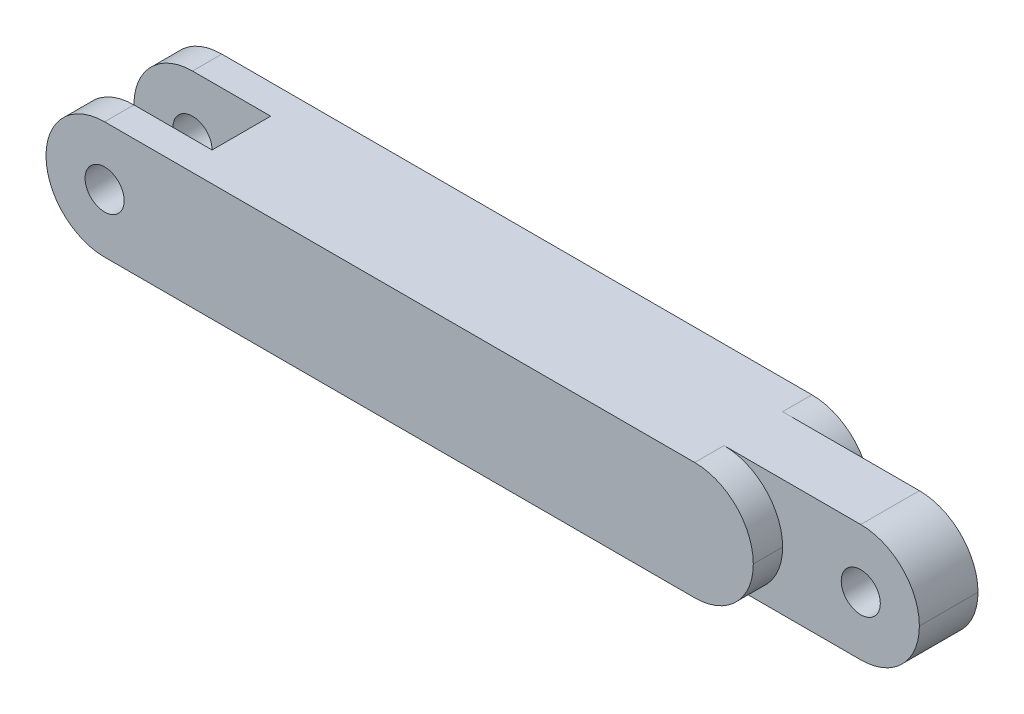
ISO-10303-21;
HEADER;
FILE_DESCRIPTION(('STEP AP214'),'2;1');
FILE_NAME('part.step','',(''),(''),'','','');
FILE_SCHEMA(('AUTOMOTIVE_DESIGN { 1 0 10303 214 1 1 1 1 }'));
ENDSEC;
DATA;
#1=APPLICATION_CONTEXT('core data for automotive mechanical design processes');
#2=APPLICATION_PROTOCOL_DEFINITION('international standard','automotive_design',2000,#1);
#3=PRODUCT_CONTEXT('',#1,'mechanical');
#4=PRODUCT('Part','Part','',(#3));
#5=PRODUCT_RELATED_PRODUCT_CATEGORY('part','',(#4));
#6=PRODUCT_DEFINITION_FORMATION('','',#4);
#7=PRODUCT_DEFINITION_CONTEXT('part definition',#1,'design');
#8=PRODUCT_DEFINITION('design','',#6,#7);
#9=PRODUCT_DEFINITION_SHAPE('','',#8);
#10=(LENGTH_UNIT() NAMED_UNIT(*) SI_UNIT(.MILLI.,.METRE.));
#11=(NAMED_UNIT(*) PLANE_ANGLE_UNIT() SI_UNIT($,.RADIAN.));
#12=(NAMED_UNIT(*) SI_UNIT($,.STERADIAN.) SOLID_ANGLE_UNIT());
#13=UNCERTAINTY_MEASURE_WITH_UNIT(LENGTH_MEASURE(1.E-05),#10,'distance_accuracy_value','');
#14=(GEOMETRIC_REPRESENTATION_CONTEXT(3) GLOBAL_UNCERTAINTY_ASSIGNED_CONTEXT((#13)) GLOBAL_UNIT_ASSIGNED_CONTEXT((#10,
#11,#12)) REPRESENTATION_CONTEXT('',''));
#15=CARTESIAN_POINT('',(0.,0.,0.));
#16=DIRECTION('',(0.,0.,1.));
#17=DIRECTION('',(1.,0.,0.));
#18=AXIS2_PLACEMENT_3D('',#15,#16,#17);
#19=CARTESIAN_POINT('',(216.,0.,15.));
#20=DIRECTION('',(0.,1.,0.));
#21=DIRECTION('',(-1.,0.,0.));
#22=AXIS2_PLACEMENT_3D('',#19,#20,#21);
#23=PLANE('',#22);
#24=DIRECTION('',(1.,0.,0.));
#25=VECTOR('',#24,1.);
#26=CARTESIAN_POINT('',(216.,0.,-15.));
#27=LINE('',#26,#25);
#28=CARTESIAN_POINT('',(15.,0.,-15.));
#29=VERTEX_POINT('',#28);
#30=CARTESIAN_POINT('',(166.,0.,-15.));
#31=VERTEX_POINT('',#30);
#32=EDGE_CURVE('E198',#29,#31,#27,.T.);
#33=ORIENTED_EDGE('',*,*,#32,.T.);
#34=DIRECTION('',(0.,0.,-1.));
#35=VECTOR('',#34,1.);
#36=CARTESIAN_POINT('',(166.,0.,15.));
#37=LINE('',#36,#35);
#38=CARTESIAN_POINT('',(166.,0.,-7.5));
#39=VERTEX_POINT('',#38);
#40=EDGE_CURVE('E272',#31,#39,#37,.F.);
#41=ORIENTED_EDGE('',*,*,#40,.T.);
#42=DIRECTION('',(-1.,0.,0.));
#43=VECTOR('',#42,1.);
#44=CARTESIAN_POINT('',(181.,0.,-7.5));
#45=LINE('',#44,#43);
#46=CARTESIAN_POINT('',(201.,0.,-7.5));
#47=VERTEX_POINT('',#46);
#48=EDGE_CURVE('E185',#47,#39,#45,.T.);
#49=ORIENTED_EDGE('',*,*,#48,.F.);
#50=DIRECTION('',(0.,0.,-1.));
#51=VECTOR('',#50,1.);
#52=CARTESIAN_POINT('',(201.,0.,15.));
#53=LINE('',#52,#51);
#54=CARTESIAN_POINT('',(201.,0.,7.49999999999999));
#55=VERTEX_POINT('',#54);
#56=EDGE_CURVE('E218',#47,#55,#53,.F.);
#57=ORIENTED_EDGE('',*,*,#56,.T.);
#58=DIRECTION('',(1.,0.,0.));
#59=VECTOR('',#58,1.);
#60=CARTESIAN_POINT('',(181.,0.,7.49999999999999));
#61=LINE('',#60,#59);
#62=CARTESIAN_POINT('',(166.,0.,7.49999999999999));
#63=VERTEX_POINT('',#62);
#64=EDGE_CURVE('E187',#63,#55,#61,.T.);
#65=ORIENTED_EDGE('',*,*,#64,.F.);
#66=DIRECTION('',(0.,0.,-1.));
#67=VECTOR('',#66,1.);
#68=CARTESIAN_POINT('',(166.,0.,15.));
#69=LINE('',#68,#67);
#70=CARTESIAN_POINT('',(166.,0.,15.));
#71=VERTEX_POINT('',#70);
#72=EDGE_CURVE('E269',#63,#71,#69,.F.);
#73=ORIENTED_EDGE('',*,*,#72,.T.);
#74=DIRECTION('',(1.,0.,0.));
#75=VECTOR('',#74,1.);
#76=CARTESIAN_POINT('',(216.,0.,15.));
#77=LINE('',#76,#75);
#78=CARTESIAN_POINT('',(15.,0.,15.));
#79=VERTEX_POINT('',#78);
#80=EDGE_CURVE('E199',#79,#71,#77,.T.);
#81=ORIENTED_EDGE('',*,*,#80,.F.);
#82=DIRECTION('',(0.,0.,-1.));
#83=VECTOR('',#82,1.);
#84=CARTESIAN_POINT('',(15.,0.,15.));
#85=LINE('',#84,#83);
#86=CARTESIAN_POINT('',(15.,0.,7.49999999999999));
#87=VERTEX_POINT('',#86);
#88=EDGE_CURVE('E215',#79,#87,#85,.T.);
#89=ORIENTED_EDGE('',*,*,#88,.T.);
#90=DIRECTION('',(-1.,0.,0.));
#91=VECTOR('',#90,1.);
#92=CARTESIAN_POINT('',(35.,0.,7.49999999999999));
#93=LINE('',#92,#91);
#94=CARTESIAN_POINT('',(35.,0.,7.49999999999999));
#95=VERTEX_POINT('',#94);
#96=EDGE_CURVE('E193',#95,#87,#93,.T.);
#97=ORIENTED_EDGE('',*,*,#96,.F.);
#98=DIRECTION('',(0.,0.,1.));
#99=VECTOR('',#98,1.);
#100=CARTESIAN_POINT('',(35.,0.,-7.5));
#101=LINE('',#100,#99);
#102=CARTESIAN_POINT('',(35.,0.,-7.5));
#103=VERTEX_POINT('',#102);
#104=EDGE_CURVE('E176',#103,#95,#101,.T.);
#105=ORIENTED_EDGE('',*,*,#104,.F.);
#106=DIRECTION('',(1.,0.,0.));
#107=VECTOR('',#106,1.);
#108=CARTESIAN_POINT('',(0.,0.,-7.5));
#109=LINE('',#108,#107);
#110=CARTESIAN_POINT('',(15.,0.,-7.5));
#111=VERTEX_POINT('',#110);
#112=EDGE_CURVE('E317',#111,#103,#109,.T.);
#113=ORIENTED_EDGE('',*,*,#112,.F.);
#114=DIRECTION('',(0.,0.,-1.));
#115=VECTOR('',#114,1.);
#116=CARTESIAN_POINT('',(15.,0.,15.));
#117=LINE('',#116,#115);
#118=EDGE_CURVE('E212',#111,#29,#117,.T.);
#119=ORIENTED_EDGE('',*,*,#118,.T.);
#120=EDGE_LOOP('',(#33,#41,#49,#57,#65,#73,#81,#89,#97,#105,#113,#119));
#121=FACE_BOUND('',#120,.T.);
#122=ADVANCED_FACE('F35',(#121),#23,.F.);
#123=CARTESIAN_POINT('',(0.,30.,15.));
#124=DIRECTION('',(0.,-1.,0.));
#125=DIRECTION('',(0.,0.,-1.));
#126=AXIS2_PLACEMENT_3D('',#123,#124,#125);
#127=PLANE('',#126);
#128=DIRECTION('',(1.,0.,0.));
#129=VECTOR('',#128,1.);
#130=CARTESIAN_POINT('',(181.,30.,-7.5));
#131=LINE('',#130,#129);
#132=CARTESIAN_POINT('',(166.,30.,-7.5));
#133=VERTEX_POINT('',#132);
#134=CARTESIAN_POINT('',(201.,30.,-7.5));
#135=VERTEX_POINT('',#134);
#136=EDGE_CURVE('E195',#133,#135,#131,.T.);
#137=ORIENTED_EDGE('',*,*,#136,.F.);
#138=DIRECTION('',(0.,0.,1.));
#139=VECTOR('',#138,1.);
#140=CARTESIAN_POINT('',(166.,30.,15.));
#141=LINE('',#140,#139);
#142=CARTESIAN_POINT('',(166.,30.,-15.));
#143=VERTEX_POINT('',#142);
#144=EDGE_CURVE('E278',#133,#143,#141,.F.);
#145=ORIENTED_EDGE('',*,*,#144,.T.);
#146=DIRECTION('',(-1.,0.,0.));
#147=VECTOR('',#146,1.);
#148=CARTESIAN_POINT('',(0.,30.,-15.));
#149=LINE('',#148,#147);
#150=CARTESIAN_POINT('',(15.,30.,-15.));
#151=VERTEX_POINT('',#150);
#152=EDGE_CURVE('E203',#143,#151,#149,.T.);
#153=ORIENTED_EDGE('',*,*,#152,.T.);
#154=DIRECTION('',(0.,0.,-1.));
#155=VECTOR('',#154,1.);
#156=CARTESIAN_POINT('',(15.,30.,15.));
#157=LINE('',#156,#155);
#158=CARTESIAN_POINT('',(15.,30.,-7.5));
#159=VERTEX_POINT('',#158);
#160=EDGE_CURVE('E227',#151,#159,#157,.F.);
#161=ORIENTED_EDGE('',*,*,#160,.T.);
#162=DIRECTION('',(-1.,0.,0.));
#163=VECTOR('',#162,1.);
#164=CARTESIAN_POINT('',(0.,30.,-7.5));
#165=LINE('',#164,#163);
#166=CARTESIAN_POINT('',(35.,30.,-7.5));
#167=VERTEX_POINT('',#166);
#168=EDGE_CURVE('E168',#167,#159,#165,.T.);
#169=ORIENTED_EDGE('',*,*,#168,.F.);
#170=DIRECTION('',(0.,0.,-1.));
#171=VECTOR('',#170,1.);
#172=CARTESIAN_POINT('',(35.,30.,-7.5));
#173=LINE('',#172,#171);
#174=CARTESIAN_POINT('',(35.,30.,7.49999999999999));
#175=VERTEX_POINT('',#174);
#176=EDGE_CURVE('E167',#175,#167,#173,.T.);
#177=ORIENTED_EDGE('',*,*,#176,.F.);
#178=DIRECTION('',(1.,0.,0.));
#179=VECTOR('',#178,1.);
#180=CARTESIAN_POINT('',(35.,30.,7.49999999999999));
#181=LINE('',#180,#179);
#182=CARTESIAN_POINT('',(15.,30.,7.49999999999999));
#183=VERTEX_POINT('',#182);
#184=EDGE_CURVE('E155',#183,#175,#181,.T.);
#185=ORIENTED_EDGE('',*,*,#184,.F.);
#186=DIRECTION('',(0.,0.,-1.));
#187=VECTOR('',#186,1.);
#188=CARTESIAN_POINT('',(15.,30.,15.));
#189=LINE('',#188,#187);
#190=CARTESIAN_POINT('',(15.,30.,15.));
#191=VERTEX_POINT('',#190);
#192=EDGE_CURVE('E225',#183,#191,#189,.F.);
#193=ORIENTED_EDGE('',*,*,#192,.T.);
#194=DIRECTION('',(-1.,0.,0.));
#195=VECTOR('',#194,1.);
#196=CARTESIAN_POINT('',(0.,30.,15.));
#197=LINE('',#196,#195);
#198=CARTESIAN_POINT('',(166.,30.,15.));
#199=VERTEX_POINT('',#198);
#200=EDGE_CURVE('E202',#199,#191,#197,.T.);
#201=ORIENTED_EDGE('',*,*,#200,.F.);
#202=DIRECTION('',(0.,0.,1.));
#203=VECTOR('',#202,1.);
#204=CARTESIAN_POINT('',(166.,30.,15.));
#205=LINE('',#204,#203);
#206=CARTESIAN_POINT('',(166.,30.,7.49999999999999));
#207=VERTEX_POINT('',#206);
#208=EDGE_CURVE('E275',#199,#207,#205,.F.);
#209=ORIENTED_EDGE('',*,*,#208,.T.);
#210=DIRECTION('',(-1.,0.,0.));
#211=VECTOR('',#210,1.);
#212=CARTESIAN_POINT('',(181.,30.,7.49999999999999));
#213=LINE('',#212,#211);
#214=CARTESIAN_POINT('',(201.,30.,7.49999999999999));
#215=VERTEX_POINT('',#214);
#216=EDGE_CURVE('E190',#215,#207,#213,.T.);
#217=ORIENTED_EDGE('',*,*,#216,.F.);
#218=DIRECTION('',(0.,0.,-1.));
#219=VECTOR('',#218,1.);
#220=CARTESIAN_POINT('',(201.,30.,15.));
#221=LINE('',#220,#219);
#222=EDGE_CURVE('E229',#215,#135,#221,.T.);
#223=ORIENTED_EDGE('',*,*,#222,.T.);
#224=EDGE_LOOP('',(#137,#145,#153,#161,#169,#177,#185,#193,#201,#209,#217,#223));
#225=FACE_BOUND('',#224,.T.);
#226=ADVANCED_FACE('F180',(#225),#127,.F.);
#227=CARTESIAN_POINT('',(0.,0.,15.));
#228=DIRECTION('',(0.,0.,-1.));
#229=DIRECTION('',(-1.,0.,0.));
#230=AXIS2_PLACEMENT_3D('',#227,#228,#229);
#231=PLANE('',#230);
#232=CARTESIAN_POINT('',(15.,15.,15.));
#233=DIRECTION('',(0.,0.,-1.));
#234=DIRECTION('',(-1.,0.,0.));
#235=AXIS2_PLACEMENT_3D('',#232,#233,#234);
#236=CIRCLE('',#235,5.);
#237=CARTESIAN_POINT('',(10.,15.,15.));
#238=VERTEX_POINT('',#237);
#239=EDGE_CURVE('E265',#238,#238,#236,.T.);
#240=ORIENTED_EDGE('',*,*,#239,.T.);
#241=EDGE_LOOP('',(#240));
#242=FACE_BOUND('',#241,.T.);
#243=ORIENTED_EDGE('',*,*,#80,.T.);
#244=CARTESIAN_POINT('',(166.,15.,15.));
#245=DIRECTION('',(0.,0.,-1.));
#246=DIRECTION('',(-1.,0.,0.));
#247=AXIS2_PLACEMENT_3D('',#244,#245,#246);
#248=CIRCLE('',#247,15.);
#249=CARTESIAN_POINT('',(181.,15.,15.));
#250=VERTEX_POINT('',#249);
#251=EDGE_CURVE('E282',#71,#250,#248,.F.);
#252=ORIENTED_EDGE('',*,*,#251,.T.);
#253=CARTESIAN_POINT('',(166.,15.,15.));
#254=DIRECTION('',(0.,0.,-1.));
#255=DIRECTION('',(-1.,0.,0.));
#256=AXIS2_PLACEMENT_3D('',#253,#254,#255);
#257=CIRCLE('',#256,15.);
#258=EDGE_CURVE('E280',#250,#199,#257,.F.);
#259=ORIENTED_EDGE('',*,*,#258,.T.);
#260=ORIENTED_EDGE('',*,*,#200,.T.);
#261=CARTESIAN_POINT('',(15.,15.,15.));
#262=DIRECTION('',(0.,0.,-1.));
#263=DIRECTION('',(-1.,0.,0.));
#264=AXIS2_PLACEMENT_3D('',#261,#262,#263);
#265=CIRCLE('',#264,15.);
#266=CARTESIAN_POINT('',(0.,15.,15.));
#267=VERTEX_POINT('',#266);
#268=EDGE_CURVE('E234',#191,#267,#265,.F.);
#269=ORIENTED_EDGE('',*,*,#268,.T.);
#270=CARTESIAN_POINT('',(15.,15.,15.));
#271=DIRECTION('',(0.,0.,-1.));
#272=DIRECTION('',(-1.,0.,0.));
#273=AXIS2_PLACEMENT_3D('',#270,#271,#272);
#274=CIRCLE('',#273,15.);
#275=EDGE_CURVE('E236',#267,#79,#274,.F.);
#276=ORIENTED_EDGE('',*,*,#275,.T.);
#277=EDGE_LOOP('',(#243,#252,#259,#260,#269,#276));
#278=FACE_BOUND('',#277,.T.);
#279=ADVANCED_FACE('F304',(#242,#278),#231,.F.);
#280=CARTESIAN_POINT('',(0.,0.,-15.));
#281=DIRECTION('',(0.,0.,-1.));
#282=DIRECTION('',(-1.,0.,0.));
#283=AXIS2_PLACEMENT_3D('',#280,#281,#282);
#284=PLANE('',#283);
#285=CARTESIAN_POINT('',(15.,15.,-15.));
#286=DIRECTION('',(0.,0.,1.));
#287=DIRECTION('',(1.,0.,0.));
#288=AXIS2_PLACEMENT_3D('',#285,#286,#287);
#289=CIRCLE('',#288,5.);
#290=CARTESIAN_POINT('',(20.,15.,-15.));
#291=VERTEX_POINT('',#290);
#292=EDGE_CURVE('E261',#291,#291,#289,.T.);
#293=ORIENTED_EDGE('',*,*,#292,.T.);
#294=EDGE_LOOP('',(#293));
#295=FACE_BOUND('',#294,.T.);
#296=CARTESIAN_POINT('',(166.,15.,-15.));
#297=DIRECTION('',(0.,0.,-1.));
#298=DIRECTION('',(-1.,0.,0.));
#299=AXIS2_PLACEMENT_3D('',#296,#297,#298);
#300=CIRCLE('',#299,15.);
#301=CARTESIAN_POINT('',(181.,15.,-15.));
#302=VERTEX_POINT('',#301);
#303=EDGE_CURVE('E247',#143,#302,#300,.T.);
#304=ORIENTED_EDGE('',*,*,#303,.T.);
#305=CARTESIAN_POINT('',(166.,15.,-15.));
#306=DIRECTION('',(0.,0.,-1.));
#307=DIRECTION('',(-1.,0.,0.));
#308=AXIS2_PLACEMENT_3D('',#305,#306,#307);
#309=CIRCLE('',#308,15.);
#310=EDGE_CURVE('E267',#302,#31,#309,.T.);
#311=ORIENTED_EDGE('',*,*,#310,.T.);
#312=ORIENTED_EDGE('',*,*,#32,.F.);
#313=CARTESIAN_POINT('',(15.,15.,-15.));
#314=DIRECTION('',(0.,0.,-1.));
#315=DIRECTION('',(-1.,0.,0.));
#316=AXIS2_PLACEMENT_3D('',#313,#314,#315);
#317=CIRCLE('',#316,15.);
#318=CARTESIAN_POINT('',(0.,15.,-15.));
#319=VERTEX_POINT('',#318);
#320=EDGE_CURVE('E241',#29,#319,#317,.T.);
#321=ORIENTED_EDGE('',*,*,#320,.T.);
#322=CARTESIAN_POINT('',(15.,15.,-15.));
#323=DIRECTION('',(0.,0.,-1.));
#324=DIRECTION('',(-1.,0.,0.));
#325=AXIS2_PLACEMENT_3D('',#322,#323,#324);
#326=CIRCLE('',#325,15.);
#327=EDGE_CURVE('E238',#319,#151,#326,.T.);
#328=ORIENTED_EDGE('',*,*,#327,.T.);
#329=ORIENTED_EDGE('',*,*,#152,.F.);
#330=EDGE_LOOP('',(#304,#311,#312,#321,#328,#329));
#331=FACE_BOUND('',#330,.T.);
#332=ADVANCED_FACE('F338',(#295,#331),#284,.T.);
#333=CARTESIAN_POINT('',(181.,-0.001000000000001,-7.5));
#334=DIRECTION('',(0.,0.,1.));
#335=DIRECTION('',(1.,0.,0.));
#336=AXIS2_PLACEMENT_3D('',#333,#334,#335);
#337=PLANE('',#336);
#338=CARTESIAN_POINT('',(201.,15.,-7.5));
#339=DIRECTION('',(0.,0.,1.));
#340=DIRECTION('',(1.,0.,0.));
#341=AXIS2_PLACEMENT_3D('',#338,#339,#340);
#342=CIRCLE('',#341,4.99999999999999);
#343=CARTESIAN_POINT('',(206.,15.,-7.5));
#344=VERTEX_POINT('',#343);
#345=EDGE_CURVE('E256',#344,#344,#342,.T.);
#346=ORIENTED_EDGE('',*,*,#345,.T.);
#347=EDGE_LOOP('',(#346));
#348=FACE_BOUND('',#347,.T.);
#349=CARTESIAN_POINT('',(201.,15.,-7.5));
#350=DIRECTION('',(0.,0.,1.));
#351=DIRECTION('',(1.,0.,0.));
#352=AXIS2_PLACEMENT_3D('',#349,#350,#351);
#353=CIRCLE('',#352,15.);
#354=CARTESIAN_POINT('',(216.,15.,-7.5));
#355=VERTEX_POINT('',#354);
#356=EDGE_CURVE('E205',#135,#355,#353,.F.);
#357=ORIENTED_EDGE('',*,*,#356,.T.);
#358=CARTESIAN_POINT('',(201.,15.,-7.5));
#359=DIRECTION('',(0.,0.,1.));
#360=DIRECTION('',(1.,0.,0.));
#361=AXIS2_PLACEMENT_3D('',#358,#359,#360);
#362=CIRCLE('',#361,15.);
#363=EDGE_CURVE('E210',#355,#47,#362,.F.);
#364=ORIENTED_EDGE('',*,*,#363,.T.);
#365=ORIENTED_EDGE('',*,*,#48,.T.);
#366=CARTESIAN_POINT('',(166.,15.,-7.5));
#367=DIRECTION('',(0.,0.,1.));
#368=DIRECTION('',(1.,0.,0.));
#369=AXIS2_PLACEMENT_3D('',#366,#367,#368);
#370=CIRCLE('',#369,15.);
#371=CARTESIAN_POINT('',(181.,15.,-7.5));
#372=VERTEX_POINT('',#371);
#373=EDGE_CURVE('E58',#39,#372,#370,.T.);
#374=ORIENTED_EDGE('',*,*,#373,.T.);
#375=CARTESIAN_POINT('',(166.,15.,-7.5));
#376=DIRECTION('',(0.,0.,1.));
#377=DIRECTION('',(1.,0.,0.));
#378=AXIS2_PLACEMENT_3D('',#375,#376,#377);
#379=CIRCLE('',#378,15.);
#380=EDGE_CURVE('E285',#372,#133,#379,.T.);
#381=ORIENTED_EDGE('',*,*,#380,.T.);
#382=ORIENTED_EDGE('',*,*,#136,.T.);
#383=EDGE_LOOP('',(#357,#364,#365,#374,#381,#382));
#384=FACE_BOUND('',#383,.T.);
#385=ADVANCED_FACE('F354',(#348,#384),#337,.F.);
#386=CARTESIAN_POINT('',(181.,-0.001000000000001,7.49999999999999));
#387=DIRECTION('',(0.,0.,-1.));
#388=DIRECTION('',(-1.,0.,0.));
#389=AXIS2_PLACEMENT_3D('',#386,#387,#388);
#390=PLANE('',#389);
#391=CARTESIAN_POINT('',(201.,15.,7.49999999999999));
#392=DIRECTION('',(0.,0.,-1.));
#393=DIRECTION('',(-1.,0.,0.));
#394=AXIS2_PLACEMENT_3D('',#391,#392,#393);
#395=CIRCLE('',#394,4.99999999999999);
#396=CARTESIAN_POINT('',(196.,15.,7.49999999999999));
#397=VERTEX_POINT('',#396);
#398=EDGE_CURVE('E262',#397,#397,#395,.T.);
#399=ORIENTED_EDGE('',*,*,#398,.T.);
#400=EDGE_LOOP('',(#399));
#401=FACE_BOUND('',#400,.T.);
#402=ORIENTED_EDGE('',*,*,#64,.T.);
#403=CARTESIAN_POINT('',(201.,15.,7.49999999999999));
#404=DIRECTION('',(0.,0.,-1.));
#405=DIRECTION('',(-1.,0.,0.));
#406=AXIS2_PLACEMENT_3D('',#403,#404,#405);
#407=CIRCLE('',#406,15.);
#408=CARTESIAN_POINT('',(216.,15.,7.49999999999999));
#409=VERTEX_POINT('',#408);
#410=EDGE_CURVE('E223',#55,#409,#407,.F.);
#411=ORIENTED_EDGE('',*,*,#410,.T.);
#412=CARTESIAN_POINT('',(201.,15.,7.49999999999999));
#413=DIRECTION('',(0.,0.,-1.));
#414=DIRECTION('',(-1.,0.,0.));
#415=AXIS2_PLACEMENT_3D('',#412,#413,#414);
#416=CIRCLE('',#415,15.);
#417=EDGE_CURVE('E221',#409,#215,#416,.F.);
#418=ORIENTED_EDGE('',*,*,#417,.T.);
#419=ORIENTED_EDGE('',*,*,#216,.T.);
#420=CARTESIAN_POINT('',(166.,15.,7.49999999999999));
#421=DIRECTION('',(0.,0.,-1.));
#422=DIRECTION('',(-1.,0.,0.));
#423=AXIS2_PLACEMENT_3D('',#420,#421,#422);
#424=CIRCLE('',#423,15.);
#425=CARTESIAN_POINT('',(181.,15.,7.49999999999999));
#426=VERTEX_POINT('',#425);
#427=EDGE_CURVE('E11',#207,#426,#424,.T.);
#428=ORIENTED_EDGE('',*,*,#427,.T.);
#429=CARTESIAN_POINT('',(166.,15.,7.49999999999999));
#430=DIRECTION('',(0.,0.,-1.));
#431=DIRECTION('',(-1.,0.,0.));
#432=AXIS2_PLACEMENT_3D('',#429,#430,#431);
#433=CIRCLE('',#432,15.);
#434=EDGE_CURVE('E44',#426,#63,#433,.T.);
#435=ORIENTED_EDGE('',*,*,#434,.T.);
#436=EDGE_LOOP('',(#402,#411,#418,#419,#428,#435));
#437=FACE_BOUND('',#436,.T.);
#438=ADVANCED_FACE('F349',(#401,#437),#390,.F.);
#439=CARTESIAN_POINT('',(0.,-0.001000000000001,-7.5));
#440=DIRECTION('',(0.,0.,-1.));
#441=DIRECTION('',(-1.,0.,0.));
#442=AXIS2_PLACEMENT_3D('',#439,#440,#441);
#443=PLANE('',#442);
#444=CARTESIAN_POINT('',(15.,15.,-7.5));
#445=DIRECTION('',(0.,0.,-1.));
#446=DIRECTION('',(-1.,0.,0.));
#447=AXIS2_PLACEMENT_3D('',#444,#445,#446);
#448=CIRCLE('',#447,5.);
#449=CARTESIAN_POINT('',(10.,15.,-7.5));
#450=VERTEX_POINT('',#449);
#451=EDGE_CURVE('E260',#450,#450,#448,.T.);
#452=ORIENTED_EDGE('',*,*,#451,.T.);
#453=EDGE_LOOP('',(#452));
#454=FACE_BOUND('',#453,.T.);
#455=CARTESIAN_POINT('',(15.,15.,-7.5));
#456=DIRECTION('',(0.,0.,-1.));
#457=DIRECTION('',(-1.,0.,0.));
#458=AXIS2_PLACEMENT_3D('',#455,#456,#457);
#459=CIRCLE('',#458,15.);
#460=CARTESIAN_POINT('',(0.,15.,-7.5));
#461=VERTEX_POINT('',#460);
#462=EDGE_CURVE('E243',#159,#461,#459,.F.);
#463=ORIENTED_EDGE('',*,*,#462,.T.);
#464=CARTESIAN_POINT('',(15.,15.,-7.5));
#465=DIRECTION('',(0.,0.,-1.));
#466=DIRECTION('',(-1.,0.,0.));
#467=AXIS2_PLACEMENT_3D('',#464,#465,#466);
#468=CIRCLE('',#467,15.);
#469=EDGE_CURVE('E245',#461,#111,#468,.F.);
#470=ORIENTED_EDGE('',*,*,#469,.T.);
#471=ORIENTED_EDGE('',*,*,#112,.T.);
#472=DIRECTION('',(0.,1.,0.));
#473=VECTOR('',#472,1.);
#474=CARTESIAN_POINT('',(35.,-0.001000000000001,-7.5));
#475=LINE('',#474,#473);
#476=EDGE_CURVE('E178',#103,#167,#475,.T.);
#477=ORIENTED_EDGE('',*,*,#476,.T.);
#478=ORIENTED_EDGE('',*,*,#168,.T.);
#479=EDGE_LOOP('',(#463,#470,#471,#477,#478));
#480=FACE_BOUND('',#479,.T.);
#481=ADVANCED_FACE('F324',(#454,#480),#443,.F.);
#482=CARTESIAN_POINT('',(35.,-0.001000000000001,-7.5));
#483=DIRECTION('',(1.,0.,0.));
#484=DIRECTION('',(0.,0.,-1.));
#485=AXIS2_PLACEMENT_3D('',#482,#483,#484);
#486=PLANE('',#485);
#487=ORIENTED_EDGE('',*,*,#104,.T.);
#488=DIRECTION('',(0.,1.,0.));
#489=VECTOR('',#488,1.);
#490=CARTESIAN_POINT('',(35.,-0.001000000000001,7.49999999999999));
#491=LINE('',#490,#489);
#492=EDGE_CURVE('E159',#95,#175,#491,.T.);
#493=ORIENTED_EDGE('',*,*,#492,.T.);
#494=ORIENTED_EDGE('',*,*,#176,.T.);
#495=ORIENTED_EDGE('',*,*,#476,.F.);
#496=EDGE_LOOP('',(#487,#493,#494,#495));
#497=FACE_BOUND('',#496,.T.);
#498=ADVANCED_FACE('F172',(#497),#486,.F.);
#499=CARTESIAN_POINT('',(35.,-0.001000000000001,7.49999999999999));
#500=DIRECTION('',(0.,0.,1.));
#501=DIRECTION('',(1.,0.,0.));
#502=AXIS2_PLACEMENT_3D('',#499,#500,#501);
#503=PLANE('',#502);
#504=CARTESIAN_POINT('',(15.,15.,7.49999999999999));
#505=DIRECTION('',(0.,0.,1.));
#506=DIRECTION('',(1.,0.,0.));
#507=AXIS2_PLACEMENT_3D('',#504,#505,#506);
#508=CIRCLE('',#507,5.);
#509=CARTESIAN_POINT('',(20.,15.,7.49999999999999));
#510=VERTEX_POINT('',#509);
#511=EDGE_CURVE('E257',#510,#510,#508,.T.);
#512=ORIENTED_EDGE('',*,*,#511,.T.);
#513=EDGE_LOOP('',(#512));
#514=FACE_BOUND('',#513,.T.);
#515=ORIENTED_EDGE('',*,*,#96,.T.);
#516=CARTESIAN_POINT('',(15.,15.,7.49999999999999));
#517=DIRECTION('',(0.,0.,1.));
#518=DIRECTION('',(1.,0.,0.));
#519=AXIS2_PLACEMENT_3D('',#516,#517,#518);
#520=CIRCLE('',#519,15.);
#521=CARTESIAN_POINT('',(0.,15.,7.5));
#522=VERTEX_POINT('',#521);
#523=EDGE_CURVE('E232',#87,#522,#520,.F.);
#524=ORIENTED_EDGE('',*,*,#523,.T.);
#525=CARTESIAN_POINT('',(15.,15.,7.49999999999999));
#526=DIRECTION('',(0.,0.,1.));
#527=DIRECTION('',(1.,0.,0.));
#528=AXIS2_PLACEMENT_3D('',#525,#526,#527);
#529=CIRCLE('',#528,15.);
#530=EDGE_CURVE('E162',#522,#183,#529,.F.);
#531=ORIENTED_EDGE('',*,*,#530,.T.);
#532=ORIENTED_EDGE('',*,*,#184,.T.);
#533=ORIENTED_EDGE('',*,*,#492,.F.);
#534=EDGE_LOOP('',(#515,#524,#531,#532,#533));
#535=FACE_BOUND('',#534,.T.);
#536=ADVANCED_FACE('F158',(#514,#535),#503,.F.);
#537=CARTESIAN_POINT('',(201.,15.,15.));
#538=DIRECTION('',(0.,0.,-1.));
#539=DIRECTION('',(-1.,0.,0.));
#540=AXIS2_PLACEMENT_3D('',#537,#538,#539);
#541=CYLINDRICAL_SURFACE('',#540,15.);
#542=ORIENTED_EDGE('',*,*,#222,.F.);
#543=ORIENTED_EDGE('',*,*,#417,.F.);
#544=DIRECTION('',(0.,0.,-1.));
#545=VECTOR('',#544,1.);
#546=CARTESIAN_POINT('',(216.,15.,15.));
#547=LINE('',#546,#545);
#548=EDGE_CURVE('E191',#355,#409,#547,.F.);
#549=ORIENTED_EDGE('',*,*,#548,.F.);
#550=ORIENTED_EDGE('',*,*,#356,.F.);
#551=EDGE_LOOP('',(#542,#543,#549,#550));
#552=FACE_BOUND('',#551,.T.);
#553=ADVANCED_FACE('F352',(#552),#541,.T.);
#554=CARTESIAN_POINT('',(201.,15.,15.));
#555=DIRECTION('',(0.,0.,-1.));
#556=DIRECTION('',(-1.,0.,0.));
#557=AXIS2_PLACEMENT_3D('',#554,#555,#556);
#558=CYLINDRICAL_SURFACE('',#557,15.);
#559=ORIENTED_EDGE('',*,*,#410,.F.);
#560=ORIENTED_EDGE('',*,*,#56,.F.);
#561=ORIENTED_EDGE('',*,*,#363,.F.);
#562=ORIENTED_EDGE('',*,*,#548,.T.);
#563=EDGE_LOOP('',(#559,#560,#561,#562));
#564=FACE_BOUND('',#563,.T.);
#565=ADVANCED_FACE('F346',(#564),#558,.T.);
#566=CARTESIAN_POINT('',(15.,15.,15.));
#567=DIRECTION('',(0.,0.,-1.));
#568=DIRECTION('',(-1.,0.,0.));
#569=AXIS2_PLACEMENT_3D('',#566,#567,#568);
#570=CYLINDRICAL_SURFACE('',#569,15.);
#571=DIRECTION('',(0.,0.,-1.));
#572=VECTOR('',#571,1.);
#573=CARTESIAN_POINT('',(0.,15.,15.));
#574=LINE('',#573,#572);
#575=EDGE_CURVE('E250',#267,#522,#574,.T.);
#576=ORIENTED_EDGE('',*,*,#575,.F.);
#577=ORIENTED_EDGE('',*,*,#268,.F.);
#578=ORIENTED_EDGE('',*,*,#192,.F.);
#579=ORIENTED_EDGE('',*,*,#530,.F.);
#580=EDGE_LOOP('',(#576,#577,#578,#579));
#581=FACE_BOUND('',#580,.T.);
#582=ADVANCED_FACE('F309',(#581),#570,.T.);
#583=CARTESIAN_POINT('',(15.,15.,15.));
#584=DIRECTION('',(0.,0.,-1.));
#585=DIRECTION('',(-1.,0.,0.));
#586=AXIS2_PLACEMENT_3D('',#583,#584,#585);
#587=CYLINDRICAL_SURFACE('',#586,15.);
#588=ORIENTED_EDGE('',*,*,#275,.F.);
#589=ORIENTED_EDGE('',*,*,#575,.T.);
#590=ORIENTED_EDGE('',*,*,#523,.F.);
#591=ORIENTED_EDGE('',*,*,#88,.F.);
#592=EDGE_LOOP('',(#588,#589,#590,#591));
#593=FACE_BOUND('',#592,.T.);
#594=ADVANCED_FACE('F315',(#593),#587,.T.);
#595=CARTESIAN_POINT('',(15.,15.,15.));
#596=DIRECTION('',(0.,0.,-1.));
#597=DIRECTION('',(-1.,0.,0.));
#598=AXIS2_PLACEMENT_3D('',#595,#596,#597);
#599=CYLINDRICAL_SURFACE('',#598,15.);
#600=DIRECTION('',(0.,0.,-1.));
#601=VECTOR('',#600,1.);
#602=CARTESIAN_POINT('',(0.,15.,15.));
#603=LINE('',#602,#601);
#604=EDGE_CURVE('E253',#461,#319,#603,.T.);
#605=ORIENTED_EDGE('',*,*,#604,.F.);
#606=ORIENTED_EDGE('',*,*,#462,.F.);
#607=ORIENTED_EDGE('',*,*,#160,.F.);
#608=ORIENTED_EDGE('',*,*,#327,.F.);
#609=EDGE_LOOP('',(#605,#606,#607,#608));
#610=FACE_BOUND('',#609,.T.);
#611=ADVANCED_FACE('F328',(#610),#599,.T.);
#612=CARTESIAN_POINT('',(15.,15.,15.));
#613=DIRECTION('',(0.,0.,-1.));
#614=DIRECTION('',(-1.,0.,0.));
#615=AXIS2_PLACEMENT_3D('',#612,#613,#614);
#616=CYLINDRICAL_SURFACE('',#615,15.);
#617=ORIENTED_EDGE('',*,*,#469,.F.);
#618=ORIENTED_EDGE('',*,*,#604,.T.);
#619=ORIENTED_EDGE('',*,*,#320,.F.);
#620=ORIENTED_EDGE('',*,*,#118,.F.);
#621=EDGE_LOOP('',(#617,#618,#619,#620));
#622=FACE_BOUND('',#621,.T.);
#623=ADVANCED_FACE('F333',(#622),#616,.T.);
#624=CARTESIAN_POINT('',(15.,15.,-15.));
#625=DIRECTION('',(0.,0.,1.));
#626=DIRECTION('',(1.,0.,0.));
#627=AXIS2_PLACEMENT_3D('',#624,#625,#626);
#628=CYLINDRICAL_SURFACE('',#627,5.);
#629=ORIENTED_EDGE('',*,*,#511,.F.);
#630=EDGE_LOOP('',(#629));
#631=FACE_BOUND('',#630,.T.);
#632=ORIENTED_EDGE('',*,*,#239,.F.);
#633=EDGE_LOOP('',(#632));
#634=FACE_BOUND('',#633,.T.);
#635=ADVANCED_FACE('F387',(#631,#634),#628,.F.);
#636=ORIENTED_EDGE('',*,*,#292,.F.);
#637=EDGE_LOOP('',(#636));
#638=FACE_BOUND('',#637,.T.);
#639=ORIENTED_EDGE('',*,*,#451,.F.);
#640=EDGE_LOOP('',(#639));
#641=FACE_BOUND('',#640,.T.);
#642=ADVANCED_FACE('F366',(#638,#641),#628,.F.);
#643=CARTESIAN_POINT('',(201.,15.,-15.));
#644=DIRECTION('',(0.,0.,1.));
#645=DIRECTION('',(1.,0.,0.));
#646=AXIS2_PLACEMENT_3D('',#643,#644,#645);
#647=CYLINDRICAL_SURFACE('',#646,4.99999999999999);
#648=ORIENTED_EDGE('',*,*,#398,.F.);
#649=EDGE_LOOP('',(#648));
#650=FACE_BOUND('',#649,.T.);
#651=ORIENTED_EDGE('',*,*,#345,.F.);
#652=EDGE_LOOP('',(#651));
#653=FACE_BOUND('',#652,.T.);
#654=ADVANCED_FACE('F359',(#650,#653),#647,.F.);
#655=CARTESIAN_POINT('',(166.,15.,-15.));
#656=DIRECTION('',(0.,0.,1.));
#657=DIRECTION('',(1.,0.,0.));
#658=AXIS2_PLACEMENT_3D('',#655,#656,#657);
#659=CYLINDRICAL_SURFACE('',#658,15.);
#660=ORIENTED_EDGE('',*,*,#144,.F.);
#661=ORIENTED_EDGE('',*,*,#380,.F.);
#662=DIRECTION('',(0.,0.,1.));
#663=VECTOR('',#662,1.);
#664=CARTESIAN_POINT('',(181.,15.,-15.));
#665=LINE('',#664,#663);
#666=EDGE_CURVE('E287',#302,#372,#665,.T.);
#667=ORIENTED_EDGE('',*,*,#666,.F.);
#668=ORIENTED_EDGE('',*,*,#303,.F.);
#669=EDGE_LOOP('',(#660,#661,#667,#668));
#670=FACE_BOUND('',#669,.T.);
#671=ADVANCED_FACE('F357',(#670),#659,.T.);
#672=CARTESIAN_POINT('',(166.,15.,-15.));
#673=DIRECTION('',(0.,0.,-1.));
#674=DIRECTION('',(-1.,0.,0.));
#675=AXIS2_PLACEMENT_3D('',#672,#673,#674);
#676=CYLINDRICAL_SURFACE('',#675,15.);
#677=ORIENTED_EDGE('',*,*,#373,.F.);
#678=ORIENTED_EDGE('',*,*,#40,.F.);
#679=ORIENTED_EDGE('',*,*,#310,.F.);
#680=ORIENTED_EDGE('',*,*,#666,.T.);
#681=EDGE_LOOP('',(#677,#678,#679,#680));
#682=FACE_BOUND('',#681,.T.);
#683=ADVANCED_FACE('F341',(#682),#676,.T.);
#684=CARTESIAN_POINT('',(166.,15.,15.));
#685=DIRECTION('',(0.,0.,1.));
#686=DIRECTION('',(1.,0.,0.));
#687=AXIS2_PLACEMENT_3D('',#684,#685,#686);
#688=CYLINDRICAL_SURFACE('',#687,15.);
#689=ORIENTED_EDGE('',*,*,#208,.F.);
#690=ORIENTED_EDGE('',*,*,#258,.F.);
#691=DIRECTION('',(0.,0.,1.));
#692=VECTOR('',#691,1.);
#693=CARTESIAN_POINT('',(181.,15.,15.));
#694=LINE('',#693,#692);
#695=EDGE_CURVE('E39',#426,#250,#694,.T.);
#696=ORIENTED_EDGE('',*,*,#695,.F.);
#697=ORIENTED_EDGE('',*,*,#427,.F.);
#698=EDGE_LOOP('',(#689,#690,#696,#697));
#699=FACE_BOUND('',#698,.T.);
#700=ADVANCED_FACE('F37',(#699),#688,.T.);
#701=CARTESIAN_POINT('',(166.,15.,15.));
#702=DIRECTION('',(0.,0.,-1.));
#703=DIRECTION('',(-1.,0.,0.));
#704=AXIS2_PLACEMENT_3D('',#701,#702,#703);
#705=CYLINDRICAL_SURFACE('',#704,15.);
#706=ORIENTED_EDGE('',*,*,#251,.F.);
#707=ORIENTED_EDGE('',*,*,#72,.F.);
#708=ORIENTED_EDGE('',*,*,#434,.F.);
#709=ORIENTED_EDGE('',*,*,#695,.T.);
#710=EDGE_LOOP('',(#706,#707,#708,#709));
#711=FACE_BOUND('',#710,.T.);
#712=ADVANCED_FACE('F297',(#711),#705,.T.);
#713=CLOSED_SHELL('',(#122,#226,#279,#332,#385,#438,#481,#498,#536,#553,#565,#582,#594,#611,
#623,#635,#642,#654,#671,#683,#700,#712));
#714=MANIFOLD_SOLID_BREP('B2',#713);
#715=ADVANCED_BREP_SHAPE_REPRESENTATION('',(#18,#714),#14);
#716=SHAPE_DEFINITION_REPRESENTATION(#9,#715);
ENDSEC;
END-ISO-10303-21;
